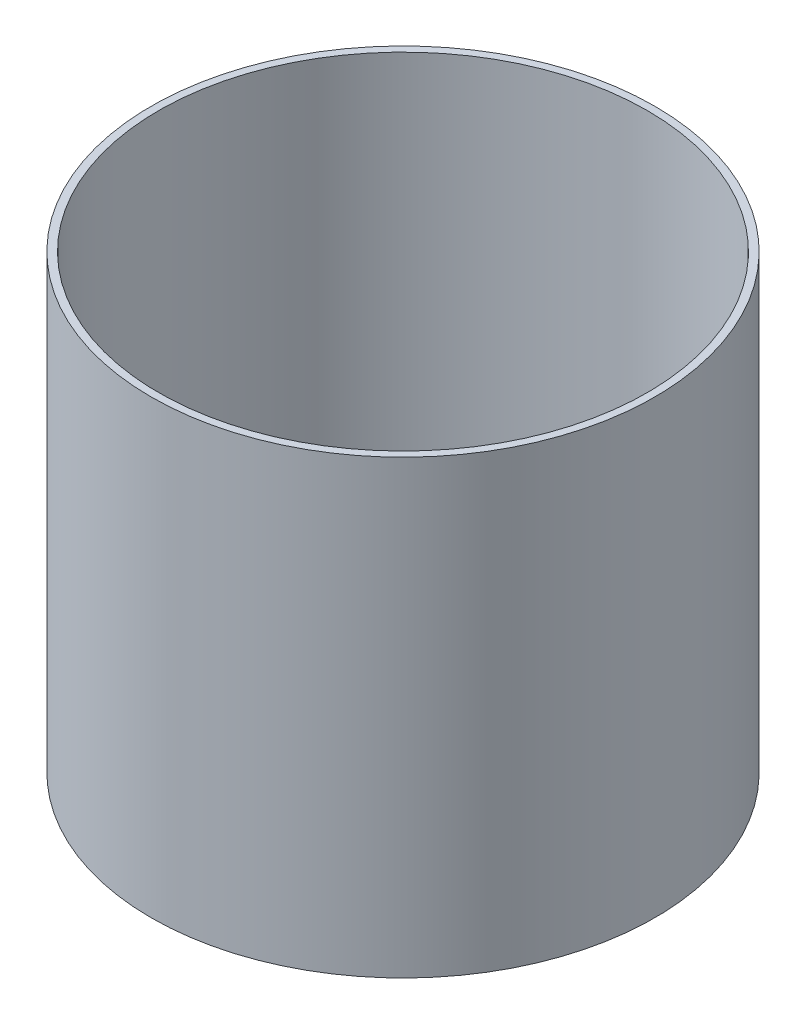
ISO-10303-21;
HEADER;
FILE_DESCRIPTION(('STEP AP214'),'2;1');
FILE_NAME('part.step','',(''),(''),'','','');
FILE_SCHEMA(('AUTOMOTIVE_DESIGN { 1 0 10303 214 1 1 1 1 }'));
ENDSEC;
DATA;
#1=APPLICATION_CONTEXT('core data for automotive mechanical design processes');
#2=APPLICATION_PROTOCOL_DEFINITION('international standard','automotive_design',2000,#1);
#3=PRODUCT_CONTEXT('',#1,'mechanical');
#4=PRODUCT('Part','Part','',(#3));
#5=PRODUCT_RELATED_PRODUCT_CATEGORY('part','',(#4));
#6=PRODUCT_DEFINITION_FORMATION('','',#4);
#7=PRODUCT_DEFINITION_CONTEXT('part definition',#1,'design');
#8=PRODUCT_DEFINITION('design','',#6,#7);
#9=PRODUCT_DEFINITION_SHAPE('','',#8);
#10=(LENGTH_UNIT() NAMED_UNIT(*) SI_UNIT(.MILLI.,.METRE.));
#11=(NAMED_UNIT(*) PLANE_ANGLE_UNIT() SI_UNIT($,.RADIAN.));
#12=(NAMED_UNIT(*) SI_UNIT($,.STERADIAN.) SOLID_ANGLE_UNIT());
#13=UNCERTAINTY_MEASURE_WITH_UNIT(LENGTH_MEASURE(1.E-05),#10,'distance_accuracy_value','');
#14=(GEOMETRIC_REPRESENTATION_CONTEXT(3) GLOBAL_UNCERTAINTY_ASSIGNED_CONTEXT((#13)) GLOBAL_UNIT_ASSIGNED_CONTEXT((#10,
#11,#12)) REPRESENTATION_CONTEXT('',''));
#15=CARTESIAN_POINT('',(0.,0.,0.));
#16=DIRECTION('',(0.,0.,1.));
#17=DIRECTION('',(1.,0.,0.));
#18=AXIS2_PLACEMENT_3D('',#15,#16,#17);
#19=CARTESIAN_POINT('',(0.,152.4,0.));
#20=DIRECTION('',(0.,1.,0.));
#21=DIRECTION('',(0.,0.,1.));
#22=AXIS2_PLACEMENT_3D('',#19,#20,#21);
#23=PLANE('',#22);
#24=CARTESIAN_POINT('',(0.,152.4,0.));
#25=DIRECTION('',(0.,1.,0.));
#26=DIRECTION('',(0.,0.,1.));
#27=AXIS2_PLACEMENT_3D('',#24,#25,#26);
#28=CIRCLE('',#27,85.09);
#29=CARTESIAN_POINT('',(0.,152.4,-85.09));
#30=VERTEX_POINT('',#29);
#31=EDGE_CURVE('E10',#30,#30,#28,.T.);
#32=ORIENTED_EDGE('',*,*,#31,.T.);
#33=EDGE_LOOP('',(#32));
#34=FACE_BOUND('',#33,.T.);
#35=CARTESIAN_POINT('',(0.,152.4,0.));
#36=DIRECTION('',(0.,1.,0.));
#37=DIRECTION('',(0.,0.,1.));
#38=AXIS2_PLACEMENT_3D('',#35,#36,#37);
#39=CIRCLE('',#38,82.55);
#40=CARTESIAN_POINT('',(0.,152.4,-82.55));
#41=VERTEX_POINT('',#40);
#42=EDGE_CURVE('E44',#41,#41,#39,.T.);
#43=ORIENTED_EDGE('',*,*,#42,.F.);
#44=EDGE_LOOP('',(#43));
#45=FACE_BOUND('',#44,.T.);
#46=ADVANCED_FACE('F33',(#34,#45),#23,.T.);
#47=CARTESIAN_POINT('',(0.,0.,0.));
#48=DIRECTION('',(0.,1.,0.));
#49=DIRECTION('',(0.,0.,1.));
#50=AXIS2_PLACEMENT_3D('',#47,#48,#49);
#51=PLANE('',#50);
#52=CARTESIAN_POINT('',(0.,0.,0.));
#53=DIRECTION('',(0.,1.,0.));
#54=DIRECTION('',(0.,0.,1.));
#55=AXIS2_PLACEMENT_3D('',#52,#53,#54);
#56=CIRCLE('',#55,85.09);
#57=CARTESIAN_POINT('',(0.,0.,-85.09));
#58=VERTEX_POINT('',#57);
#59=EDGE_CURVE('E37',#58,#58,#56,.T.);
#60=ORIENTED_EDGE('',*,*,#59,.F.);
#61=EDGE_LOOP('',(#60));
#62=FACE_BOUND('',#61,.T.);
#63=CARTESIAN_POINT('',(0.,0.,0.));
#64=DIRECTION('',(0.,1.,0.));
#65=DIRECTION('',(0.,0.,1.));
#66=AXIS2_PLACEMENT_3D('',#63,#64,#65);
#67=CIRCLE('',#66,82.55);
#68=CARTESIAN_POINT('',(0.,0.,-82.55));
#69=VERTEX_POINT('',#68);
#70=EDGE_CURVE('E46',#69,#69,#67,.T.);
#71=ORIENTED_EDGE('',*,*,#70,.T.);
#72=EDGE_LOOP('',(#71));
#73=FACE_BOUND('',#72,.T.);
#74=ADVANCED_FACE('F56',(#62,#73),#51,.F.);
#75=CARTESIAN_POINT('',(0.,152.4,0.));
#76=DIRECTION('',(0.,-1.,0.));
#77=DIRECTION('',(0.,0.,-1.));
#78=AXIS2_PLACEMENT_3D('',#75,#76,#77);
#79=CYLINDRICAL_SURFACE('',#78,85.09);
#80=CARTESIAN_POINT('',(0.,152.4,-85.09));
#81=CARTESIAN_POINT('',(0.,150.8125,-85.09));
#82=CARTESIAN_POINT('',(0.,149.225,-85.09));
#83=CARTESIAN_POINT('',(0.,146.05,-85.09));
#84=CARTESIAN_POINT('',(0.,144.4625,-85.09));
#85=CARTESIAN_POINT('',(0.,141.2875,-85.09));
#86=CARTESIAN_POINT('',(0.,139.7,-85.09));
#87=CARTESIAN_POINT('',(0.,136.525,-85.09));
#88=CARTESIAN_POINT('',(0.,134.9375,-85.09));
#89=CARTESIAN_POINT('',(0.,131.7625,-85.09));
#90=CARTESIAN_POINT('',(0.,130.175,-85.09));
#91=CARTESIAN_POINT('',(0.,127.,-85.09));
#92=CARTESIAN_POINT('',(0.,125.4125,-85.09));
#93=CARTESIAN_POINT('',(0.,122.2375,-85.09));
#94=CARTESIAN_POINT('',(0.,120.65,-85.09));
#95=CARTESIAN_POINT('',(0.,117.475,-85.09));
#96=CARTESIAN_POINT('',(0.,115.8875,-85.09));
#97=CARTESIAN_POINT('',(0.,112.7125,-85.09));
#98=CARTESIAN_POINT('',(0.,111.125,-85.09));
#99=CARTESIAN_POINT('',(0.,107.95,-85.09));
#100=CARTESIAN_POINT('',(0.,106.3625,-85.09));
#101=CARTESIAN_POINT('',(0.,103.1875,-85.09));
#102=CARTESIAN_POINT('',(0.,101.6,-85.09));
#103=CARTESIAN_POINT('',(0.,98.425,-85.09));
#104=CARTESIAN_POINT('',(0.,96.8375,-85.09));
#105=CARTESIAN_POINT('',(0.,93.6625,-85.09));
#106=CARTESIAN_POINT('',(0.,92.075,-85.09));
#107=CARTESIAN_POINT('',(0.,88.9,-85.09));
#108=CARTESIAN_POINT('',(0.,87.3125,-85.09));
#109=CARTESIAN_POINT('',(0.,84.1375,-85.09));
#110=CARTESIAN_POINT('',(0.,82.55,-85.09));
#111=CARTESIAN_POINT('',(0.,79.375,-85.09));
#112=CARTESIAN_POINT('',(0.,77.7875,-85.09));
#113=CARTESIAN_POINT('',(0.,74.6125,-85.09));
#114=CARTESIAN_POINT('',(0.,73.025,-85.09));
#115=CARTESIAN_POINT('',(0.,69.85,-85.09));
#116=CARTESIAN_POINT('',(0.,68.2625,-85.09));
#117=CARTESIAN_POINT('',(0.,65.0875,-85.09));
#118=CARTESIAN_POINT('',(0.,63.5,-85.09));
#119=CARTESIAN_POINT('',(0.,60.325,-85.09));
#120=CARTESIAN_POINT('',(0.,58.7375,-85.09));
#121=CARTESIAN_POINT('',(0.,55.5625,-85.09));
#122=CARTESIAN_POINT('',(0.,53.975,-85.09));
#123=CARTESIAN_POINT('',(0.,50.8,-85.09));
#124=CARTESIAN_POINT('',(0.,49.2125,-85.09));
#125=CARTESIAN_POINT('',(0.,46.0375,-85.09));
#126=CARTESIAN_POINT('',(0.,44.45,-85.09));
#127=CARTESIAN_POINT('',(0.,41.275,-85.09));
#128=CARTESIAN_POINT('',(0.,39.6875,-85.09));
#129=CARTESIAN_POINT('',(0.,36.5125,-85.09));
#130=CARTESIAN_POINT('',(0.,34.925,-85.09));
#131=CARTESIAN_POINT('',(0.,31.75,-85.09));
#132=CARTESIAN_POINT('',(0.,30.1625,-85.09));
#133=CARTESIAN_POINT('',(0.,26.9875,-85.09));
#134=CARTESIAN_POINT('',(0.,25.4,-85.09));
#135=CARTESIAN_POINT('',(0.,22.225,-85.09));
#136=CARTESIAN_POINT('',(0.,20.6375,-85.09));
#137=CARTESIAN_POINT('',(0.,17.4625,-85.09));
#138=CARTESIAN_POINT('',(0.,15.875,-85.09));
#139=CARTESIAN_POINT('',(0.,12.7,-85.09));
#140=CARTESIAN_POINT('',(0.,11.1125,-85.09));
#141=CARTESIAN_POINT('',(0.,7.93750000000001,-85.09));
#142=CARTESIAN_POINT('',(0.,6.35,-85.09));
#143=CARTESIAN_POINT('',(0.,3.175,-85.09));
#144=CARTESIAN_POINT('',(0.,1.5875,-85.09));
#145=CARTESIAN_POINT('',(0.,0.,-85.09));
#146=B_SPLINE_CURVE_WITH_KNOTS('',3,(#80,#81,#82,#83,#84,#85,#86,#87,#88,#89,#90,#91,#92,#93,
#94,#95,#96,#97,#98,#99,#100,#101,#102,#103,#104,#105,#106,#107,#108,#109,#110,#111,#112,#113,
#114,#115,#116,#117,#118,#119,#120,#121,#122,#123,#124,#125,#126,#127,#128,#129,#130,#131,#132,
#133,#134,#135,#136,#137,#138,#139,#140,#141,#142,#143,#144,#145),.UNSPECIFIED.,.F.,.F.,(4,2,2,
2,2,2,2,2,2,2,2,2,2,2,2,2,2,2,2,2,2,2,2,2,2,2,2,2,2,2,2,2,4),(0.,4.7625,9.52500000000001,
14.2875,19.05,23.8125,28.575,33.3375,38.1,42.8625,47.625,52.3875,57.15,61.9125,66.675,71.4375,
76.2,80.9625,85.725,90.4875,95.25,100.0125,104.775,109.5375,114.3,119.0625,123.825,128.5875,
133.35,138.1125,142.875,147.6375,152.4),.UNSPECIFIED.);
#147=EDGE_CURVE('BSEAM35',#30,#58,#146,.T.);
#148=ORIENTED_EDGE('',*,*,#31,.F.);
#149=ORIENTED_EDGE('',*,*,#59,.T.);
#150=ORIENTED_EDGE('',*,*,#147,.T.);
#151=ORIENTED_EDGE('',*,*,#147,.F.);
#152=EDGE_LOOP('',(#148,#150,#149,#151));
#153=FACE_BOUND('',#152,.T.);
#154=ADVANCED_FACE('F35',(#153),#79,.T.);
#155=CARTESIAN_POINT('',(0.,152.4,0.));
#156=DIRECTION('',(0.,-1.,0.));
#157=DIRECTION('',(0.,0.,-1.));
#158=AXIS2_PLACEMENT_3D('',#155,#156,#157);
#159=CYLINDRICAL_SURFACE('',#158,82.55);
#160=CARTESIAN_POINT('',(0.,152.4,-82.55));
#161=CARTESIAN_POINT('',(0.,150.8125,-82.55));
#162=CARTESIAN_POINT('',(0.,149.225,-82.55));
#163=CARTESIAN_POINT('',(0.,146.05,-82.55));
#164=CARTESIAN_POINT('',(0.,144.4625,-82.55));
#165=CARTESIAN_POINT('',(0.,141.2875,-82.55));
#166=CARTESIAN_POINT('',(0.,139.7,-82.55));
#167=CARTESIAN_POINT('',(0.,136.525,-82.55));
#168=CARTESIAN_POINT('',(0.,134.9375,-82.55));
#169=CARTESIAN_POINT('',(0.,131.7625,-82.55));
#170=CARTESIAN_POINT('',(0.,130.175,-82.55));
#171=CARTESIAN_POINT('',(0.,127.,-82.55));
#172=CARTESIAN_POINT('',(0.,125.4125,-82.55));
#173=CARTESIAN_POINT('',(0.,122.2375,-82.55));
#174=CARTESIAN_POINT('',(0.,120.65,-82.55));
#175=CARTESIAN_POINT('',(0.,117.475,-82.55));
#176=CARTESIAN_POINT('',(0.,115.8875,-82.55));
#177=CARTESIAN_POINT('',(0.,112.7125,-82.55));
#178=CARTESIAN_POINT('',(0.,111.125,-82.55));
#179=CARTESIAN_POINT('',(0.,107.95,-82.55));
#180=CARTESIAN_POINT('',(0.,106.3625,-82.55));
#181=CARTESIAN_POINT('',(0.,103.1875,-82.55));
#182=CARTESIAN_POINT('',(0.,101.6,-82.55));
#183=CARTESIAN_POINT('',(0.,98.425,-82.55));
#184=CARTESIAN_POINT('',(0.,96.8375,-82.55));
#185=CARTESIAN_POINT('',(0.,93.6625,-82.55));
#186=CARTESIAN_POINT('',(0.,92.075,-82.55));
#187=CARTESIAN_POINT('',(0.,88.9,-82.55));
#188=CARTESIAN_POINT('',(0.,87.3125,-82.55));
#189=CARTESIAN_POINT('',(0.,84.1375,-82.55));
#190=CARTESIAN_POINT('',(0.,82.55,-82.55));
#191=CARTESIAN_POINT('',(0.,79.375,-82.55));
#192=CARTESIAN_POINT('',(0.,77.7875,-82.55));
#193=CARTESIAN_POINT('',(0.,74.6125,-82.55));
#194=CARTESIAN_POINT('',(0.,73.025,-82.55));
#195=CARTESIAN_POINT('',(0.,69.85,-82.55));
#196=CARTESIAN_POINT('',(0.,68.2625,-82.55));
#197=CARTESIAN_POINT('',(0.,65.0875,-82.55));
#198=CARTESIAN_POINT('',(0.,63.5,-82.55));
#199=CARTESIAN_POINT('',(0.,60.325,-82.55));
#200=CARTESIAN_POINT('',(0.,58.7375,-82.55));
#201=CARTESIAN_POINT('',(0.,55.5625,-82.55));
#202=CARTESIAN_POINT('',(0.,53.975,-82.55));
#203=CARTESIAN_POINT('',(0.,50.8,-82.55));
#204=CARTESIAN_POINT('',(0.,49.2125,-82.55));
#205=CARTESIAN_POINT('',(0.,46.0375,-82.55));
#206=CARTESIAN_POINT('',(0.,44.45,-82.55));
#207=CARTESIAN_POINT('',(0.,41.275,-82.55));
#208=CARTESIAN_POINT('',(0.,39.6875,-82.55));
#209=CARTESIAN_POINT('',(0.,36.5125,-82.55));
#210=CARTESIAN_POINT('',(0.,34.925,-82.55));
#211=CARTESIAN_POINT('',(0.,31.75,-82.55));
#212=CARTESIAN_POINT('',(0.,30.1625,-82.55));
#213=CARTESIAN_POINT('',(0.,26.9875,-82.55));
#214=CARTESIAN_POINT('',(0.,25.4,-82.55));
#215=CARTESIAN_POINT('',(0.,22.225,-82.55));
#216=CARTESIAN_POINT('',(0.,20.6375,-82.55));
#217=CARTESIAN_POINT('',(0.,17.4625,-82.55));
#218=CARTESIAN_POINT('',(0.,15.875,-82.55));
#219=CARTESIAN_POINT('',(0.,12.7,-82.55));
#220=CARTESIAN_POINT('',(0.,11.1125,-82.55));
#221=CARTESIAN_POINT('',(0.,7.93750000000001,-82.55));
#222=CARTESIAN_POINT('',(0.,6.35,-82.55));
#223=CARTESIAN_POINT('',(0.,3.175,-82.55));
#224=CARTESIAN_POINT('',(0.,1.5875,-82.55));
#225=CARTESIAN_POINT('',(0.,0.,-82.55));
#226=B_SPLINE_CURVE_WITH_KNOTS('',3,(#160,#161,#162,#163,#164,#165,#166,#167,#168,#169,#170,
#171,#172,#173,#174,#175,#176,#177,#178,#179,#180,#181,#182,#183,#184,#185,#186,#187,#188,#189,
#190,#191,#192,#193,#194,#195,#196,#197,#198,#199,#200,#201,#202,#203,#204,#205,#206,#207,#208,
#209,#210,#211,#212,#213,#214,#215,#216,#217,#218,#219,#220,#221,#222,#223,#224,#225),
.UNSPECIFIED.,.F.,.F.,(4,2,2,2,2,2,2,2,2,2,2,2,2,2,2,2,2,2,2,2,2,2,2,2,2,2,2,2,2,2,2,2,4),(0.,
4.76249999999998,9.52499999999998,14.2875,19.05,23.8125,28.575,33.3375,38.1,42.8625,47.625,
52.3875,57.15,61.9125,66.675,71.4375,76.2,80.9625,85.725,90.4875,95.25,100.0125,104.775,
109.5375,114.3,119.0625,123.825,128.5875,133.35,138.1125,142.875,147.6375,152.4),.UNSPECIFIED.);
#227=EDGE_CURVE('BSEAM52',#41,#69,#226,.T.);
#228=ORIENTED_EDGE('',*,*,#42,.T.);
#229=ORIENTED_EDGE('',*,*,#70,.F.);
#230=ORIENTED_EDGE('',*,*,#227,.T.);
#231=ORIENTED_EDGE('',*,*,#227,.F.);
#232=EDGE_LOOP('',(#228,#230,#229,#231));
#233=FACE_BOUND('',#232,.T.);
#234=ADVANCED_FACE('F52',(#233),#159,.F.);
#235=CLOSED_SHELL('',(#46,#74,#154,#234));
#236=MANIFOLD_SOLID_BREP('B2',#235);
#237=ADVANCED_BREP_SHAPE_REPRESENTATION('',(#18,#236),#14);
#238=SHAPE_DEFINITION_REPRESENTATION(#9,#237);
ENDSEC;
END-ISO-10303-21;
